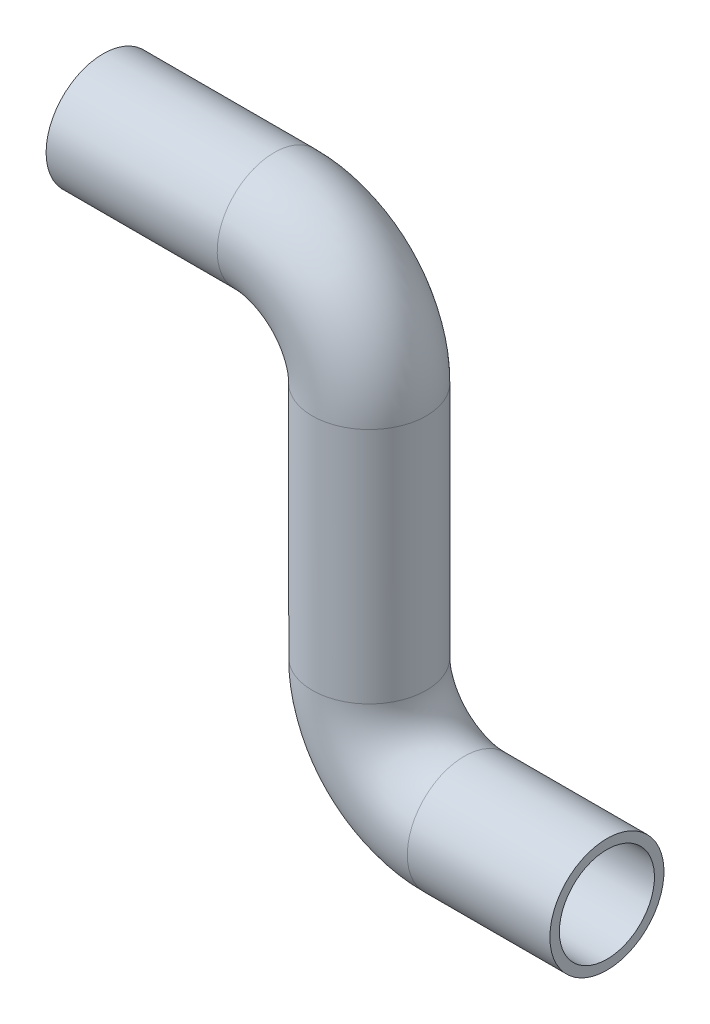
ISO-10303-21;
HEADER;
FILE_DESCRIPTION(('STEP AP214'),'2;1');
FILE_NAME('part.step','',(''),(''),'','','');
FILE_SCHEMA(('AUTOMOTIVE_DESIGN { 1 0 10303 214 1 1 1 1 }'));
ENDSEC;
DATA;
#1=APPLICATION_CONTEXT('core data for automotive mechanical design processes');
#2=APPLICATION_PROTOCOL_DEFINITION('international standard','automotive_design',2000,#1);
#3=PRODUCT_CONTEXT('',#1,'mechanical');
#4=PRODUCT('Part','Part','',(#3));
#5=PRODUCT_RELATED_PRODUCT_CATEGORY('part','',(#4));
#6=PRODUCT_DEFINITION_FORMATION('','',#4);
#7=PRODUCT_DEFINITION_CONTEXT('part definition',#1,'design');
#8=PRODUCT_DEFINITION('design','',#6,#7);
#9=PRODUCT_DEFINITION_SHAPE('','',#8);
#10=(LENGTH_UNIT() NAMED_UNIT(*) SI_UNIT(.MILLI.,.METRE.));
#11=(NAMED_UNIT(*) PLANE_ANGLE_UNIT() SI_UNIT($,.RADIAN.));
#12=(NAMED_UNIT(*) SI_UNIT($,.STERADIAN.) SOLID_ANGLE_UNIT());
#13=UNCERTAINTY_MEASURE_WITH_UNIT(LENGTH_MEASURE(1.E-05),#10,'distance_accuracy_value','');
#14=(GEOMETRIC_REPRESENTATION_CONTEXT(3) GLOBAL_UNCERTAINTY_ASSIGNED_CONTEXT((#13)) GLOBAL_UNIT_ASSIGNED_CONTEXT((#10,
#11,#12)) REPRESENTATION_CONTEXT('',''));
#15=CARTESIAN_POINT('',(0.,0.,0.));
#16=DIRECTION('',(0.,0.,1.));
#17=DIRECTION('',(1.,0.,0.));
#18=AXIS2_PLACEMENT_3D('',#15,#16,#17);
#19=CARTESIAN_POINT('',(0.,0.,0.));
#20=DIRECTION('',(-1.,0.,0.));
#21=DIRECTION('',(0.,0.,1.));
#22=AXIS2_PLACEMENT_3D('',#19,#20,#21);
#23=PLANE('',#22);
#24=CARTESIAN_POINT('',(0.,0.,0.));
#25=DIRECTION('',(-1.,0.,0.));
#26=DIRECTION('',(0.,0.,1.));
#27=AXIS2_PLACEMENT_3D('',#24,#25,#26);
#28=CIRCLE('',#27,5.);
#29=CARTESIAN_POINT('',(0.,0.,5.));
#30=VERTEX_POINT('',#29);
#31=EDGE_CURVE('E245',#30,#30,#28,.T.);
#32=ORIENTED_EDGE('',*,*,#31,.F.);
#33=EDGE_LOOP('',(#32));
#34=FACE_BOUND('',#33,.T.);
#35=CARTESIAN_POINT('',(0.,0.,0.));
#36=DIRECTION('',(-1.,0.,0.));
#37=DIRECTION('',(0.,0.,1.));
#38=AXIS2_PLACEMENT_3D('',#35,#36,#37);
#39=CIRCLE('',#38,6.);
#40=CARTESIAN_POINT('',(0.,0.,6.));
#41=VERTEX_POINT('',#40);
#42=EDGE_CURVE('E75',#41,#41,#39,.T.);
#43=ORIENTED_EDGE('',*,*,#42,.T.);
#44=EDGE_LOOP('',(#43));
#45=FACE_BOUND('',#44,.T.);
#46=ADVANCED_FACE('F53',(#34,#45),#23,.T.);
#47=CARTESIAN_POINT('',(53.,-45.,0.));
#48=DIRECTION('',(-1.,0.,0.));
#49=DIRECTION('',(0.,0.,1.));
#50=AXIS2_PLACEMENT_3D('',#47,#48,#49);
#51=PLANE('',#50);
#52=CARTESIAN_POINT('',(53.,-45.,0.));
#53=DIRECTION('',(-1.,0.,0.));
#54=DIRECTION('',(0.,0.,1.));
#55=AXIS2_PLACEMENT_3D('',#52,#53,#54);
#56=CIRCLE('',#55,5.);
#57=CARTESIAN_POINT('',(53.,-45.,5.));
#58=VERTEX_POINT('',#57);
#59=EDGE_CURVE('E79',#58,#58,#56,.T.);
#60=ORIENTED_EDGE('',*,*,#59,.T.);
#61=EDGE_LOOP('',(#60));
#62=FACE_BOUND('',#61,.T.);
#63=CARTESIAN_POINT('',(53.,-45.,0.));
#64=DIRECTION('',(-1.,0.,0.));
#65=DIRECTION('',(0.,0.,1.));
#66=AXIS2_PLACEMENT_3D('',#63,#64,#65);
#67=CIRCLE('',#66,6.);
#68=CARTESIAN_POINT('',(53.,-45.,6.));
#69=VERTEX_POINT('',#68);
#70=EDGE_CURVE('E11',#69,#69,#67,.T.);
#71=ORIENTED_EDGE('',*,*,#70,.F.);
#72=EDGE_LOOP('',(#71));
#73=FACE_BOUND('',#72,.T.);
#74=ADVANCED_FACE('F143',(#62,#73),#51,.F.);
#75=CARTESIAN_POINT('',(0.,0.,0.));
#76=DIRECTION('',(1.,0.,0.));
#77=DIRECTION('',(0.,0.,-1.));
#78=AXIS2_PLACEMENT_3D('',#75,#76,#77);
#79=CYLINDRICAL_SURFACE('',#78,6.);
#80=CARTESIAN_POINT('',(18.,0.,0.));
#81=DIRECTION('',(1.,0.,0.));
#82=DIRECTION('',(0.,0.,-1.));
#83=AXIS2_PLACEMENT_3D('',#80,#81,#82);
#84=CIRCLE('',#83,6.);
#85=CARTESIAN_POINT('',(18.,6.,0.));
#86=VERTEX_POINT('',#85);
#87=EDGE_CURVE('E78',#86,#86,#84,.F.);
#88=ORIENTED_EDGE('',*,*,#87,.T.);
#89=EDGE_LOOP('',(#88));
#90=FACE_BOUND('',#89,.T.);
#91=ORIENTED_EDGE('',*,*,#42,.F.);
#92=EDGE_LOOP('',(#91));
#93=FACE_BOUND('',#92,.T.);
#94=ADVANCED_FACE('F112',(#90,#93),#79,.T.);
#95=CARTESIAN_POINT('',(18.,-10.,0.));
#96=DIRECTION('',(0.,0.,-1.));
#97=DIRECTION('',(-1.,0.,0.));
#98=AXIS2_PLACEMENT_3D('',#95,#96,#97);
#99=TOROIDAL_SURFACE('',#98,10.,6.);
#100=CARTESIAN_POINT('',(28.,-10.,0.));
#101=DIRECTION('',(0.,1.,0.));
#102=DIRECTION('',(-1.,0.,0.));
#103=AXIS2_PLACEMENT_3D('',#100,#101,#102);
#104=CIRCLE('',#103,6.);
#105=CARTESIAN_POINT('',(34.,-10.,0.));
#106=VERTEX_POINT('',#105);
#107=EDGE_CURVE('E72',#106,#106,#104,.T.);
#108=CARTESIAN_POINT('',(18.,-10.,0.));
#109=DIRECTION('',(0.,0.,-1.));
#110=DIRECTION('',(-1.,0.,0.));
#111=AXIS2_PLACEMENT_3D('',#108,#109,#110);
#112=CIRCLE('',#111,16.);
#113=EDGE_CURVE('',#86,#106,#112,.T.);
#114=ORIENTED_EDGE('',*,*,#87,.F.);
#115=ORIENTED_EDGE('',*,*,#107,.T.);
#116=ORIENTED_EDGE('',*,*,#113,.T.);
#117=ORIENTED_EDGE('',*,*,#113,.F.);
#118=EDGE_LOOP('',(#114,#116,#115,#117));
#119=FACE_BOUND('',#118,.T.);
#120=ADVANCED_FACE('F100',(#119),#99,.T.);
#121=CARTESIAN_POINT('',(28.,-9.99999999999999,0.));
#122=DIRECTION('',(0.,-1.,0.));
#123=DIRECTION('',(1.,0.,0.));
#124=AXIS2_PLACEMENT_3D('',#121,#122,#123);
#125=CYLINDRICAL_SURFACE('',#124,6.);
#126=CARTESIAN_POINT('',(28.,-35.,0.));
#127=DIRECTION('',(0.,-1.,0.));
#128=DIRECTION('',(1.,0.,0.));
#129=AXIS2_PLACEMENT_3D('',#126,#127,#128);
#130=CIRCLE('',#129,6.);
#131=CARTESIAN_POINT('',(22.,-35.,0.));
#132=VERTEX_POINT('',#131);
#133=EDGE_CURVE('E66',#132,#132,#130,.F.);
#134=ORIENTED_EDGE('',*,*,#133,.T.);
#135=EDGE_LOOP('',(#134));
#136=FACE_BOUND('',#135,.T.);
#137=ORIENTED_EDGE('',*,*,#107,.F.);
#138=EDGE_LOOP('',(#137));
#139=FACE_BOUND('',#138,.T.);
#140=ADVANCED_FACE('F103',(#136,#139),#125,.T.);
#141=CARTESIAN_POINT('',(38.,-35.,0.));
#142=DIRECTION('',(0.,0.,1.));
#143=DIRECTION('',(1.,0.,0.));
#144=AXIS2_PLACEMENT_3D('',#141,#142,#143);
#145=TOROIDAL_SURFACE('',#144,9.99999999999999,6.);
#146=CARTESIAN_POINT('',(38.,-45.,0.));
#147=DIRECTION('',(-1.,0.,0.));
#148=DIRECTION('',(0.,-1.,0.));
#149=AXIS2_PLACEMENT_3D('',#146,#147,#148);
#150=CIRCLE('',#149,6.);
#151=CARTESIAN_POINT('',(38.,-51.,0.));
#152=VERTEX_POINT('',#151);
#153=EDGE_CURVE('E61',#152,#152,#150,.T.);
#154=CARTESIAN_POINT('',(38.,-35.,0.));
#155=DIRECTION('',(0.,0.,1.));
#156=DIRECTION('',(1.,0.,0.));
#157=AXIS2_PLACEMENT_3D('',#154,#155,#156);
#158=CIRCLE('',#157,16.);
#159=EDGE_CURVE('',#132,#152,#158,.T.);
#160=ORIENTED_EDGE('',*,*,#133,.F.);
#161=ORIENTED_EDGE('',*,*,#153,.T.);
#162=ORIENTED_EDGE('',*,*,#159,.T.);
#163=ORIENTED_EDGE('',*,*,#159,.F.);
#164=EDGE_LOOP('',(#160,#162,#161,#163));
#165=FACE_BOUND('',#164,.T.);
#166=ADVANCED_FACE('F105',(#165),#145,.T.);
#167=CARTESIAN_POINT('',(38.,-45.,0.));
#168=DIRECTION('',(1.,0.,0.));
#169=DIRECTION('',(0.,0.,-1.));
#170=AXIS2_PLACEMENT_3D('',#167,#168,#169);
#171=CYLINDRICAL_SURFACE('',#170,6.);
#172=ORIENTED_EDGE('',*,*,#70,.T.);
#173=EDGE_LOOP('',(#172));
#174=FACE_BOUND('',#173,.T.);
#175=ORIENTED_EDGE('',*,*,#153,.F.);
#176=EDGE_LOOP('',(#175));
#177=FACE_BOUND('',#176,.T.);
#178=ADVANCED_FACE('F55',(#174,#177),#171,.T.);
#179=CARTESIAN_POINT('',(0.,0.,0.));
#180=DIRECTION('',(1.,0.,0.));
#181=DIRECTION('',(0.,0.,-1.));
#182=AXIS2_PLACEMENT_3D('',#179,#180,#181);
#183=CYLINDRICAL_SURFACE('',#182,5.);
#184=CARTESIAN_POINT('',(18.,0.,0.));
#185=DIRECTION('',(-1.,0.,0.));
#186=DIRECTION('',(0.,0.,1.));
#187=AXIS2_PLACEMENT_3D('',#184,#185,#186);
#188=CIRCLE('',#187,5.);
#189=CARTESIAN_POINT('',(18.,5.,0.));
#190=VERTEX_POINT('',#189);
#191=EDGE_CURVE('E247',#190,#190,#188,.T.);
#192=ORIENTED_EDGE('',*,*,#191,.F.);
#193=EDGE_LOOP('',(#192));
#194=FACE_BOUND('',#193,.T.);
#195=ORIENTED_EDGE('',*,*,#31,.T.);
#196=EDGE_LOOP('',(#195));
#197=FACE_BOUND('',#196,.T.);
#198=ADVANCED_FACE('F115',(#194,#197),#183,.F.);
#199=CARTESIAN_POINT('',(18.,-10.,0.));
#200=DIRECTION('',(0.,0.,-1.));
#201=DIRECTION('',(-1.,0.,0.));
#202=AXIS2_PLACEMENT_3D('',#199,#200,#201);
#203=TOROIDAL_SURFACE('',#202,10.,5.);
#204=CARTESIAN_POINT('',(28.,-10.,0.));
#205=DIRECTION('',(0.,1.,0.));
#206=DIRECTION('',(0.,0.,1.));
#207=AXIS2_PLACEMENT_3D('',#204,#205,#206);
#208=CIRCLE('',#207,5.);
#209=CARTESIAN_POINT('',(33.,-10.,0.));
#210=VERTEX_POINT('',#209);
#211=EDGE_CURVE('E251',#210,#210,#208,.T.);
#212=CARTESIAN_POINT('',(18.,-10.,0.));
#213=DIRECTION('',(0.,0.,-1.));
#214=DIRECTION('',(-1.,0.,0.));
#215=AXIS2_PLACEMENT_3D('',#212,#213,#214);
#216=CIRCLE('',#215,15.);
#217=EDGE_CURVE('',#190,#210,#216,.T.);
#218=ORIENTED_EDGE('',*,*,#191,.T.);
#219=ORIENTED_EDGE('',*,*,#211,.F.);
#220=ORIENTED_EDGE('',*,*,#217,.T.);
#221=ORIENTED_EDGE('',*,*,#217,.F.);
#222=EDGE_LOOP('',(#218,#220,#219,#221));
#223=FACE_BOUND('',#222,.T.);
#224=ADVANCED_FACE('F119',(#223),#203,.F.);
#225=CARTESIAN_POINT('',(28.,-9.99999999999999,0.));
#226=DIRECTION('',(0.,-1.,0.));
#227=DIRECTION('',(1.,0.,0.));
#228=AXIS2_PLACEMENT_3D('',#225,#226,#227);
#229=CYLINDRICAL_SURFACE('',#228,5.);
#230=CARTESIAN_POINT('',(28.,-35.,0.));
#231=DIRECTION('',(0.,1.,0.));
#232=DIRECTION('',(0.,0.,1.));
#233=AXIS2_PLACEMENT_3D('',#230,#231,#232);
#234=CIRCLE('',#233,5.);
#235=CARTESIAN_POINT('',(23.,-35.,0.));
#236=VERTEX_POINT('',#235);
#237=EDGE_CURVE('E93',#236,#236,#234,.T.);
#238=ORIENTED_EDGE('',*,*,#237,.F.);
#239=EDGE_LOOP('',(#238));
#240=FACE_BOUND('',#239,.T.);
#241=ORIENTED_EDGE('',*,*,#211,.T.);
#242=EDGE_LOOP('',(#241));
#243=FACE_BOUND('',#242,.T.);
#244=ADVANCED_FACE('F126',(#240,#243),#229,.F.);
#245=CARTESIAN_POINT('',(38.,-35.,0.));
#246=DIRECTION('',(0.,0.,1.));
#247=DIRECTION('',(1.,0.,0.));
#248=AXIS2_PLACEMENT_3D('',#245,#246,#247);
#249=TOROIDAL_SURFACE('',#248,9.99999999999999,5.);
#250=CARTESIAN_POINT('',(38.,-45.,0.));
#251=DIRECTION('',(-1.,0.,0.));
#252=DIRECTION('',(0.,0.,1.));
#253=AXIS2_PLACEMENT_3D('',#250,#251,#252);
#254=CIRCLE('',#253,5.);
#255=CARTESIAN_POINT('',(38.,-50.,0.));
#256=VERTEX_POINT('',#255);
#257=EDGE_CURVE('E87',#256,#256,#254,.T.);
#258=CARTESIAN_POINT('',(38.,-35.,0.));
#259=DIRECTION('',(0.,0.,1.));
#260=DIRECTION('',(1.,0.,0.));
#261=AXIS2_PLACEMENT_3D('',#258,#259,#260);
#262=CIRCLE('',#261,15.);
#263=EDGE_CURVE('',#236,#256,#262,.T.);
#264=ORIENTED_EDGE('',*,*,#237,.T.);
#265=ORIENTED_EDGE('',*,*,#257,.F.);
#266=ORIENTED_EDGE('',*,*,#263,.T.);
#267=ORIENTED_EDGE('',*,*,#263,.F.);
#268=EDGE_LOOP('',(#264,#266,#265,#267));
#269=FACE_BOUND('',#268,.T.);
#270=ADVANCED_FACE('F134',(#269),#249,.F.);
#271=CARTESIAN_POINT('',(38.,-45.,0.));
#272=DIRECTION('',(1.,0.,0.));
#273=DIRECTION('',(0.,0.,-1.));
#274=AXIS2_PLACEMENT_3D('',#271,#272,#273);
#275=CYLINDRICAL_SURFACE('',#274,5.);
#276=ORIENTED_EDGE('',*,*,#59,.F.);
#277=EDGE_LOOP('',(#276));
#278=FACE_BOUND('',#277,.T.);
#279=ORIENTED_EDGE('',*,*,#257,.T.);
#280=EDGE_LOOP('',(#279));
#281=FACE_BOUND('',#280,.T.);
#282=ADVANCED_FACE('F138',(#278,#281),#275,.F.);
#283=CLOSED_SHELL('',(#46,#74,#94,#120,#140,#166,#178,#198,#224,#244,#270,#282));
#284=MANIFOLD_SOLID_BREP('B2',#283);
#285=ADVANCED_BREP_SHAPE_REPRESENTATION('',(#18,#284),#14);
#286=SHAPE_DEFINITION_REPRESENTATION(#9,#285);
ENDSEC;
END-ISO-10303-21;
